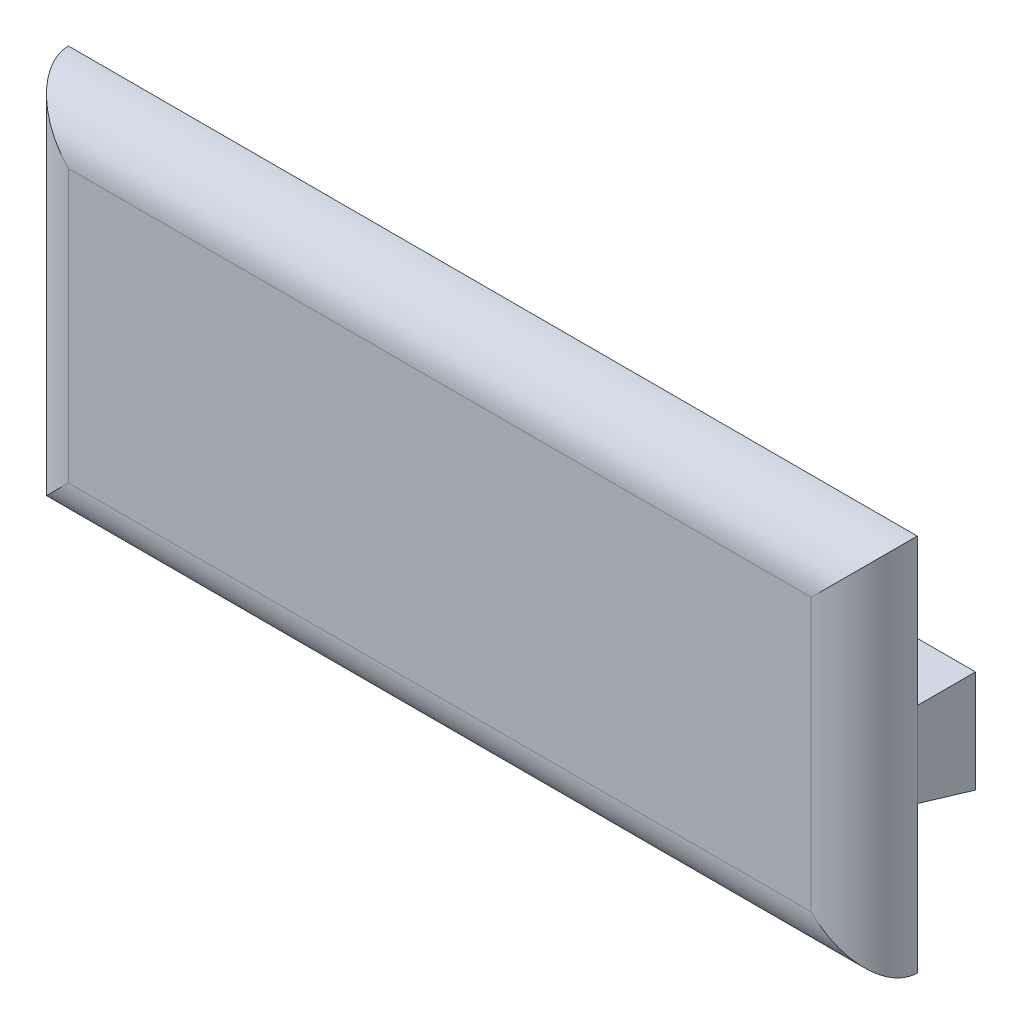
ISO-10303-21;
HEADER;
FILE_DESCRIPTION(('STEP AP214'),'2;1');
FILE_NAME('part.step','',(''),(''),'','','');
FILE_SCHEMA(('AUTOMOTIVE_DESIGN { 1 0 10303 214 1 1 1 1 }'));
ENDSEC;
DATA;
#1=APPLICATION_CONTEXT('core data for automotive mechanical design processes');
#2=APPLICATION_PROTOCOL_DEFINITION('international standard','automotive_design',2000,#1);
#3=PRODUCT_CONTEXT('',#1,'mechanical');
#4=PRODUCT('Part','Part','',(#3));
#5=PRODUCT_RELATED_PRODUCT_CATEGORY('part','',(#4));
#6=PRODUCT_DEFINITION_FORMATION('','',#4);
#7=PRODUCT_DEFINITION_CONTEXT('part definition',#1,'design');
#8=PRODUCT_DEFINITION('design','',#6,#7);
#9=PRODUCT_DEFINITION_SHAPE('','',#8);
#10=(LENGTH_UNIT() NAMED_UNIT(*) SI_UNIT(.MILLI.,.METRE.));
#11=(NAMED_UNIT(*) PLANE_ANGLE_UNIT() SI_UNIT($,.RADIAN.));
#12=(NAMED_UNIT(*) SI_UNIT($,.STERADIAN.) SOLID_ANGLE_UNIT());
#13=UNCERTAINTY_MEASURE_WITH_UNIT(LENGTH_MEASURE(1.E-05),#10,'distance_accuracy_value','');
#14=(GEOMETRIC_REPRESENTATION_CONTEXT(3) GLOBAL_UNCERTAINTY_ASSIGNED_CONTEXT((#13)) GLOBAL_UNIT_ASSIGNED_CONTEXT((#10,
#11,#12)) REPRESENTATION_CONTEXT('',''));
#15=CARTESIAN_POINT('',(0.,0.,0.));
#16=DIRECTION('',(0.,0.,1.));
#17=DIRECTION('',(1.,0.,0.));
#18=AXIS2_PLACEMENT_3D('',#15,#16,#17);
#19=CARTESIAN_POINT('',(0.,0.,0.));
#20=DIRECTION('',(0.,0.,-1.));
#21=DIRECTION('',(-1.,0.,0.));
#22=AXIS2_PLACEMENT_3D('',#19,#20,#21);
#23=PLANE('',#22);
#24=DIRECTION('',(1.,0.,0.));
#25=VECTOR('',#24,1.);
#26=CARTESIAN_POINT('',(12.,1.2,0.));
#27=LINE('',#26,#25);
#28=CARTESIAN_POINT('',(-12.,1.2,0.));
#29=VERTEX_POINT('',#28);
#30=CARTESIAN_POINT('',(12.,1.2,0.));
#31=VERTEX_POINT('',#30);
#32=EDGE_CURVE('E132',#29,#31,#27,.T.);
#33=ORIENTED_EDGE('',*,*,#32,.F.);
#34=DIRECTION('',(0.,-1.,0.));
#35=VECTOR('',#34,1.);
#36=CARTESIAN_POINT('',(-12.,-5.35,0.));
#37=LINE('',#36,#35);
#38=CARTESIAN_POINT('',(-12.,5.35,0.));
#39=VERTEX_POINT('',#38);
#40=EDGE_CURVE('E106',#39,#29,#37,.T.);
#41=ORIENTED_EDGE('',*,*,#40,.F.);
#42=DIRECTION('',(-1.,0.,0.));
#43=VECTOR('',#42,1.);
#44=CARTESIAN_POINT('',(-12.,5.35,0.));
#45=LINE('',#44,#43);
#46=CARTESIAN_POINT('',(12.,5.35,0.));
#47=VERTEX_POINT('',#46);
#48=EDGE_CURVE('E107',#47,#39,#45,.T.);
#49=ORIENTED_EDGE('',*,*,#48,.F.);
#50=DIRECTION('',(0.,1.,0.));
#51=VECTOR('',#50,1.);
#52=CARTESIAN_POINT('',(12.,-5.35,0.));
#53=LINE('',#52,#51);
#54=EDGE_CURVE('E143',#31,#47,#53,.T.);
#55=ORIENTED_EDGE('',*,*,#54,.F.);
#56=EDGE_LOOP('',(#33,#41,#49,#55));
#57=FACE_BOUND('',#56,.T.);
#58=ADVANCED_FACE('F32',(#57),#23,.T.);
#59=CARTESIAN_POINT('',(0.,0.,1.5));
#60=DIRECTION('',(0.,0.,-1.));
#61=DIRECTION('',(-1.,0.,0.));
#62=AXIS2_PLACEMENT_3D('',#59,#60,#61);
#63=PLANE('',#62);
#64=DIRECTION('',(0.,-1.,0.));
#65=VECTOR('',#64,1.);
#66=CARTESIAN_POINT('',(-10.5,0.,1.5));
#67=LINE('',#66,#65);
#68=CARTESIAN_POINT('',(-10.5,3.85,1.5));
#69=VERTEX_POINT('',#68);
#70=CARTESIAN_POINT('',(-10.5,-3.85,1.5));
#71=VERTEX_POINT('',#70);
#72=EDGE_CURVE('E41',#69,#71,#67,.T.);
#73=ORIENTED_EDGE('',*,*,#72,.T.);
#74=DIRECTION('',(1.,0.,0.));
#75=VECTOR('',#74,1.);
#76=CARTESIAN_POINT('',(0.,-3.85,1.5));
#77=LINE('',#76,#75);
#78=CARTESIAN_POINT('',(10.5,-3.85,1.5));
#79=VERTEX_POINT('',#78);
#80=EDGE_CURVE('E11',#71,#79,#77,.T.);
#81=ORIENTED_EDGE('',*,*,#80,.T.);
#82=DIRECTION('',(0.,1.,0.));
#83=VECTOR('',#82,1.);
#84=CARTESIAN_POINT('',(10.5,0.,1.5));
#85=LINE('',#84,#83);
#86=CARTESIAN_POINT('',(10.5,3.85,1.5));
#87=VERTEX_POINT('',#86);
#88=EDGE_CURVE('E173',#79,#87,#85,.T.);
#89=ORIENTED_EDGE('',*,*,#88,.T.);
#90=DIRECTION('',(-1.,0.,0.));
#91=VECTOR('',#90,1.);
#92=CARTESIAN_POINT('',(0.,3.85,1.5));
#93=LINE('',#92,#91);
#94=EDGE_CURVE('E52',#87,#69,#93,.T.);
#95=ORIENTED_EDGE('',*,*,#94,.T.);
#96=EDGE_LOOP('',(#73,#81,#89,#95));
#97=FACE_BOUND('',#96,.T.);
#98=ADVANCED_FACE('F209',(#97),#63,.F.);
#99=DIRECTION('',(-1.,0.,0.));
#100=VECTOR('',#99,1.);
#101=CARTESIAN_POINT('',(12.,-1.2,0.));
#102=LINE('',#101,#100);
#103=CARTESIAN_POINT('',(12.,-1.2,0.));
#104=VERTEX_POINT('',#103);
#105=CARTESIAN_POINT('',(-12.,-1.2,0.));
#106=VERTEX_POINT('',#105);
#107=EDGE_CURVE('E100',#104,#106,#102,.T.);
#108=ORIENTED_EDGE('',*,*,#107,.F.);
#109=CARTESIAN_POINT('',(12.,-5.35,0.));
#110=VERTEX_POINT('',#109);
#111=EDGE_CURVE('E170',#110,#104,#53,.T.);
#112=ORIENTED_EDGE('',*,*,#111,.F.);
#113=DIRECTION('',(1.,0.,0.));
#114=VECTOR('',#113,1.);
#115=CARTESIAN_POINT('',(-12.,-5.35,0.));
#116=LINE('',#115,#114);
#117=CARTESIAN_POINT('',(-12.,-5.35,0.));
#118=VERTEX_POINT('',#117);
#119=EDGE_CURVE('E103',#118,#110,#116,.T.);
#120=ORIENTED_EDGE('',*,*,#119,.F.);
#121=EDGE_CURVE('E97',#106,#118,#37,.T.);
#122=ORIENTED_EDGE('',*,*,#121,.F.);
#123=EDGE_LOOP('',(#108,#112,#120,#122));
#124=FACE_BOUND('',#123,.T.);
#125=ADVANCED_FACE('F99',(#124),#23,.T.);
#126=CARTESIAN_POINT('',(12.,1.2,0.));
#127=DIRECTION('',(0.984807753012208,0.,0.173648177666931));
#128=DIRECTION('',(0.173648177666931,0.,-0.984807753012208));
#129=AXIS2_PLACEMENT_3D('',#126,#127,#128);
#130=PLANE('',#129);
#131=DIRECTION('',(0.,-1.,0.));
#132=VECTOR('',#131,1.);
#133=CARTESIAN_POINT('',(12.,1.2,0.));
#134=LINE('',#133,#132);
#135=EDGE_CURVE('E119',#31,#104,#134,.T.);
#136=ORIENTED_EDGE('',*,*,#135,.T.);
#137=DIRECTION('',(-0.171087869746036,0.171087869746036,0.970287525247814));
#138=VECTOR('',#137,1.);
#139=CARTESIAN_POINT('',(12.,-1.2,0.));
#140=LINE('',#139,#138);
#141=CARTESIAN_POINT('',(12.2468577729919,-1.44685777299185,-1.4));
#142=VERTEX_POINT('',#141);
#143=EDGE_CURVE('E116',#142,#104,#140,.T.);
#144=ORIENTED_EDGE('',*,*,#143,.F.);
#145=DIRECTION('',(0.,1.,0.));
#146=VECTOR('',#145,1.);
#147=CARTESIAN_POINT('',(12.2468577729919,1.2,-1.4));
#148=LINE('',#147,#146);
#149=CARTESIAN_POINT('',(12.2468577729919,1.44685777299185,-1.4));
#150=VERTEX_POINT('',#149);
#151=EDGE_CURVE('E135',#150,#142,#148,.F.);
#152=ORIENTED_EDGE('',*,*,#151,.F.);
#153=DIRECTION('',(-0.171087869746036,-0.171087869746036,0.970287525247814));
#154=VECTOR('',#153,1.);
#155=CARTESIAN_POINT('',(12.,1.2,0.));
#156=LINE('',#155,#154);
#157=EDGE_CURVE('E150',#150,#31,#156,.T.);
#158=ORIENTED_EDGE('',*,*,#157,.T.);
#159=EDGE_LOOP('',(#136,#144,#152,#158));
#160=FACE_BOUND('',#159,.T.);
#161=ADVANCED_FACE('F205',(#160),#130,.T.);
#162=CARTESIAN_POINT('',(12.,-1.2,0.));
#163=DIRECTION('',(0.,-0.984807753012208,0.173648177666931));
#164=DIRECTION('',(0.,-0.173648177666931,-0.984807753012208));
#165=AXIS2_PLACEMENT_3D('',#162,#163,#164);
#166=PLANE('',#165);
#167=ORIENTED_EDGE('',*,*,#107,.T.);
#168=DIRECTION('',(0.171087869746036,0.171087869746036,0.970287525247814));
#169=VECTOR('',#168,1.);
#170=CARTESIAN_POINT('',(-11.9297494579818,-1.12974945798183,0.398410621765923));
#171=LINE('',#170,#169);
#172=CARTESIAN_POINT('',(-12.2468577729918,-1.44685777299185,-1.4));
#173=VERTEX_POINT('',#172);
#174=EDGE_CURVE('E113',#173,#106,#171,.T.);
#175=ORIENTED_EDGE('',*,*,#174,.F.);
#176=DIRECTION('',(1.,0.,0.));
#177=VECTOR('',#176,1.);
#178=CARTESIAN_POINT('',(12.,-1.44685777299185,-1.4));
#179=LINE('',#178,#177);
#180=EDGE_CURVE('E158',#142,#173,#179,.F.);
#181=ORIENTED_EDGE('',*,*,#180,.F.);
#182=ORIENTED_EDGE('',*,*,#143,.T.);
#183=EDGE_LOOP('',(#167,#175,#181,#182));
#184=FACE_BOUND('',#183,.T.);
#185=ADVANCED_FACE('F112',(#184),#166,.T.);
#186=CARTESIAN_POINT('',(-12.,1.2,0.));
#187=DIRECTION('',(-0.984807753012208,0.,0.173648177666931));
#188=DIRECTION('',(0.173648177666931,0.,0.984807753012208));
#189=AXIS2_PLACEMENT_3D('',#186,#187,#188);
#190=PLANE('',#189);
#191=DIRECTION('',(0.,1.,0.));
#192=VECTOR('',#191,1.);
#193=CARTESIAN_POINT('',(-12.,1.2,0.));
#194=LINE('',#193,#192);
#195=EDGE_CURVE('E118',#106,#29,#194,.T.);
#196=ORIENTED_EDGE('',*,*,#195,.T.);
#197=DIRECTION('',(0.171087869746036,-0.171087869746036,0.970287525247814));
#198=VECTOR('',#197,1.);
#199=CARTESIAN_POINT('',(-11.2974945798183,0.497494579818324,3.98410621765923));
#200=LINE('',#199,#198);
#201=CARTESIAN_POINT('',(-12.2468577729918,1.44685777299185,-1.4));
#202=VERTEX_POINT('',#201);
#203=EDGE_CURVE('E127',#202,#29,#200,.T.);
#204=ORIENTED_EDGE('',*,*,#203,.F.);
#205=DIRECTION('',(0.,-1.,0.));
#206=VECTOR('',#205,1.);
#207=CARTESIAN_POINT('',(-12.2468577729918,1.2,-1.4));
#208=LINE('',#207,#206);
#209=EDGE_CURVE('E126',#173,#202,#208,.F.);
#210=ORIENTED_EDGE('',*,*,#209,.F.);
#211=ORIENTED_EDGE('',*,*,#174,.T.);
#212=EDGE_LOOP('',(#196,#204,#210,#211));
#213=FACE_BOUND('',#212,.T.);
#214=ADVANCED_FACE('F123',(#213),#190,.T.);
#215=CARTESIAN_POINT('',(12.,1.2,0.));
#216=DIRECTION('',(0.,0.984807753012208,0.173648177666931));
#217=DIRECTION('',(0.,-0.173648177666931,0.984807753012208));
#218=AXIS2_PLACEMENT_3D('',#215,#216,#217);
#219=PLANE('',#218);
#220=ORIENTED_EDGE('',*,*,#32,.T.);
#221=ORIENTED_EDGE('',*,*,#157,.F.);
#222=DIRECTION('',(-1.,0.,0.));
#223=VECTOR('',#222,1.);
#224=CARTESIAN_POINT('',(12.,1.44685777299185,-1.4));
#225=LINE('',#224,#223);
#226=EDGE_CURVE('E161',#202,#150,#225,.F.);
#227=ORIENTED_EDGE('',*,*,#226,.F.);
#228=ORIENTED_EDGE('',*,*,#203,.T.);
#229=EDGE_LOOP('',(#220,#221,#227,#228));
#230=FACE_BOUND('',#229,.T.);
#231=ADVANCED_FACE('F200',(#230),#219,.T.);
#232=CARTESIAN_POINT('',(0.,0.,-1.4));
#233=DIRECTION('',(0.,0.,-1.));
#234=DIRECTION('',(-1.,0.,0.));
#235=AXIS2_PLACEMENT_3D('',#232,#233,#234);
#236=PLANE('',#235);
#237=ORIENTED_EDGE('',*,*,#151,.T.);
#238=ORIENTED_EDGE('',*,*,#180,.T.);
#239=ORIENTED_EDGE('',*,*,#209,.T.);
#240=ORIENTED_EDGE('',*,*,#226,.T.);
#241=EDGE_LOOP('',(#237,#238,#239,#240));
#242=FACE_BOUND('',#241,.T.);
#243=ADVANCED_FACE('F227',(#242),#236,.T.);
#244=CARTESIAN_POINT('',(0.,3.85,0.));
#245=DIRECTION('',(-1.,0.,0.));
#246=DIRECTION('',(0.,0.,1.));
#247=AXIS2_PLACEMENT_3D('',#244,#245,#246);
#248=CYLINDRICAL_SURFACE('',#247,1.5);
#249=CARTESIAN_POINT('',(10.5,3.85,0.));
#250=DIRECTION('',(-0.707106781186547,0.707106781186547,0.));
#251=DIRECTION('',(0.707106781186547,0.707106781186547,0.));
#252=AXIS2_PLACEMENT_3D('',#249,#250,#251);
#253=ELLIPSE('',#252,2.12132034355964,1.5);
#254=EDGE_CURVE('E189',#47,#87,#253,.F.);
#255=ORIENTED_EDGE('',*,*,#254,.F.);
#256=ORIENTED_EDGE('',*,*,#48,.T.);
#257=CARTESIAN_POINT('',(-10.5,3.85,0.));
#258=DIRECTION('',(-0.707106781186547,-0.707106781186547,0.));
#259=DIRECTION('',(-0.707106781186547,0.707106781186547,0.));
#260=AXIS2_PLACEMENT_3D('',#257,#258,#259);
#261=ELLIPSE('',#260,2.12132034355964,1.5);
#262=EDGE_CURVE('E36',#69,#39,#261,.T.);
#263=ORIENTED_EDGE('',*,*,#262,.F.);
#264=ORIENTED_EDGE('',*,*,#94,.F.);
#265=EDGE_LOOP('',(#255,#256,#263,#264));
#266=FACE_BOUND('',#265,.T.);
#267=ADVANCED_FACE('F34',(#266),#248,.T.);
#268=CARTESIAN_POINT('',(-10.5,0.,0.));
#269=DIRECTION('',(0.,-1.,0.));
#270=DIRECTION('',(0.,0.,-1.));
#271=AXIS2_PLACEMENT_3D('',#268,#269,#270);
#272=CYLINDRICAL_SURFACE('',#271,1.5);
#273=ORIENTED_EDGE('',*,*,#195,.F.);
#274=ORIENTED_EDGE('',*,*,#121,.T.);
#275=CARTESIAN_POINT('',(-10.5,-3.85,0.));
#276=DIRECTION('',(0.707106781186547,-0.707106781186547,0.));
#277=DIRECTION('',(-0.707106781186547,-0.707106781186547,0.));
#278=AXIS2_PLACEMENT_3D('',#275,#276,#277);
#279=ELLIPSE('',#278,2.12132034355964,1.5);
#280=EDGE_CURVE('E188',#71,#118,#279,.T.);
#281=ORIENTED_EDGE('',*,*,#280,.F.);
#282=ORIENTED_EDGE('',*,*,#72,.F.);
#283=ORIENTED_EDGE('',*,*,#262,.T.);
#284=ORIENTED_EDGE('',*,*,#40,.T.);
#285=EDGE_LOOP('',(#273,#274,#281,#282,#283,#284));
#286=FACE_BOUND('',#285,.T.);
#287=ADVANCED_FACE('F130',(#286),#272,.T.);
#288=CARTESIAN_POINT('',(10.5,0.,0.));
#289=DIRECTION('',(0.,1.,0.));
#290=DIRECTION('',(0.,0.,1.));
#291=AXIS2_PLACEMENT_3D('',#288,#289,#290);
#292=CYLINDRICAL_SURFACE('',#291,1.5);
#293=ORIENTED_EDGE('',*,*,#254,.T.);
#294=ORIENTED_EDGE('',*,*,#88,.F.);
#295=CARTESIAN_POINT('',(10.5,-3.85,0.));
#296=DIRECTION('',(0.707106781186547,0.707106781186547,0.));
#297=DIRECTION('',(-0.707106781186547,0.707106781186547,0.));
#298=AXIS2_PLACEMENT_3D('',#295,#296,#297);
#299=ELLIPSE('',#298,2.12132034355964,1.5);
#300=EDGE_CURVE('E186',#110,#79,#299,.F.);
#301=ORIENTED_EDGE('',*,*,#300,.F.);
#302=ORIENTED_EDGE('',*,*,#111,.T.);
#303=ORIENTED_EDGE('',*,*,#135,.F.);
#304=ORIENTED_EDGE('',*,*,#54,.T.);
#305=EDGE_LOOP('',(#293,#294,#301,#302,#303,#304));
#306=FACE_BOUND('',#305,.T.);
#307=ADVANCED_FACE('F206',(#306),#292,.T.);
#308=CARTESIAN_POINT('',(0.,-3.85,0.));
#309=DIRECTION('',(1.,0.,0.));
#310=DIRECTION('',(0.,0.,-1.));
#311=AXIS2_PLACEMENT_3D('',#308,#309,#310);
#312=CYLINDRICAL_SURFACE('',#311,1.5);
#313=ORIENTED_EDGE('',*,*,#280,.T.);
#314=ORIENTED_EDGE('',*,*,#119,.T.);
#315=ORIENTED_EDGE('',*,*,#300,.T.);
#316=ORIENTED_EDGE('',*,*,#80,.F.);
#317=EDGE_LOOP('',(#313,#314,#315,#316));
#318=FACE_BOUND('',#317,.T.);
#319=ADVANCED_FACE('F208',(#318),#312,.T.);
#320=CLOSED_SHELL('',(#58,#98,#125,#161,#185,#214,#231,#243,#267,#287,#307,#319));
#321=MANIFOLD_SOLID_BREP('B2',#320);
#322=ADVANCED_BREP_SHAPE_REPRESENTATION('',(#18,#321),#14);
#323=SHAPE_DEFINITION_REPRESENTATION(#9,#322);
ENDSEC;
END-ISO-10303-21;
